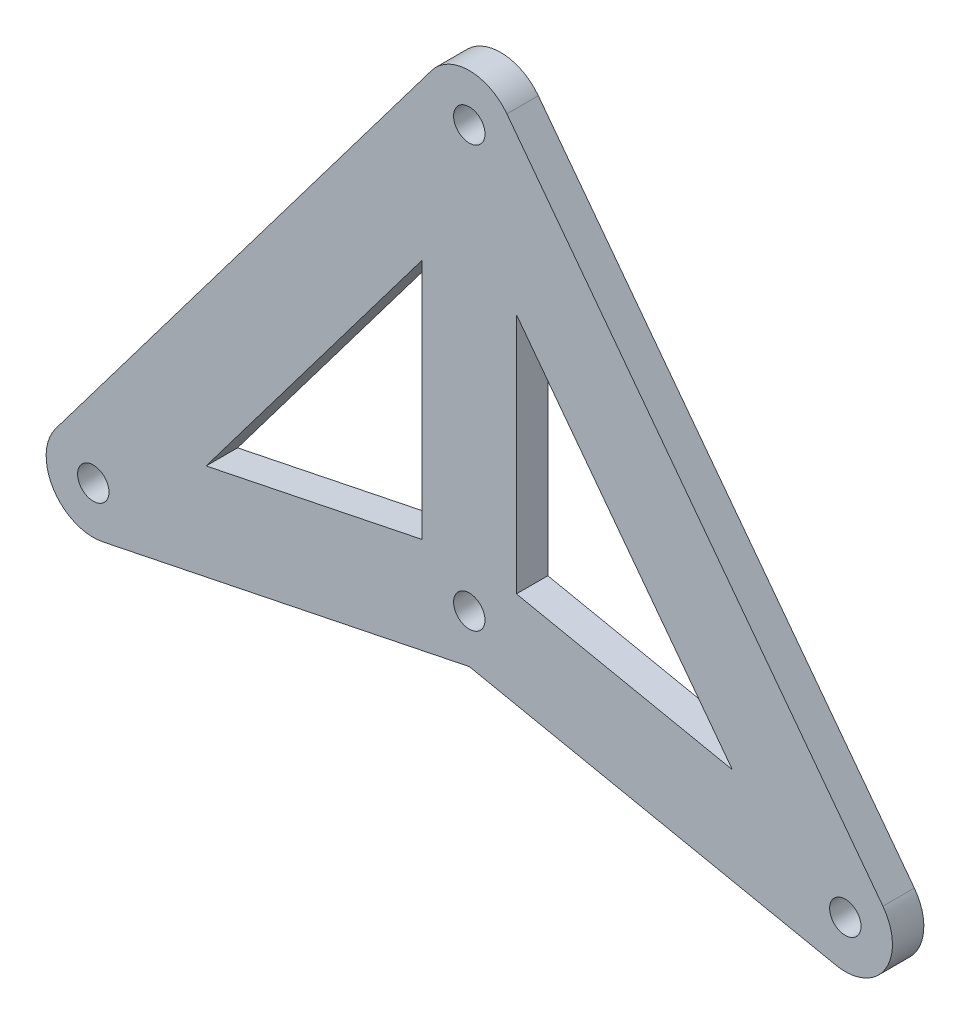
ISO-10303-21;
HEADER;
FILE_DESCRIPTION(('STEP AP214'),'2;1');
FILE_NAME('part.step','',(''),(''),'','','');
FILE_SCHEMA(('AUTOMOTIVE_DESIGN { 1 0 10303 214 1 1 1 1 }'));
ENDSEC;
DATA;
#1=APPLICATION_CONTEXT('core data for automotive mechanical design processes');
#2=APPLICATION_PROTOCOL_DEFINITION('international standard','automotive_design',2000,#1);
#3=PRODUCT_CONTEXT('',#1,'mechanical');
#4=PRODUCT('Part','Part','',(#3));
#5=PRODUCT_RELATED_PRODUCT_CATEGORY('part','',(#4));
#6=PRODUCT_DEFINITION_FORMATION('','',#4);
#7=PRODUCT_DEFINITION_CONTEXT('part definition',#1,'design');
#8=PRODUCT_DEFINITION('design','',#6,#7);
#9=PRODUCT_DEFINITION_SHAPE('','',#8);
#10=(LENGTH_UNIT() NAMED_UNIT(*) SI_UNIT(.MILLI.,.METRE.));
#11=(NAMED_UNIT(*) PLANE_ANGLE_UNIT() SI_UNIT($,.RADIAN.));
#12=(NAMED_UNIT(*) SI_UNIT($,.STERADIAN.) SOLID_ANGLE_UNIT());
#13=UNCERTAINTY_MEASURE_WITH_UNIT(LENGTH_MEASURE(1.E-05),#10,'distance_accuracy_value','');
#14=(GEOMETRIC_REPRESENTATION_CONTEXT(3) GLOBAL_UNCERTAINTY_ASSIGNED_CONTEXT((#13)) GLOBAL_UNIT_ASSIGNED_CONTEXT((#10,
#11,#12)) REPRESENTATION_CONTEXT('',''));
#15=CARTESIAN_POINT('',(0.,0.,0.));
#16=DIRECTION('',(0.,0.,1.));
#17=DIRECTION('',(1.,0.,0.));
#18=AXIS2_PLACEMENT_3D('',#15,#16,#17);
#19=CARTESIAN_POINT('',(-38.,-7.80000000000001,-7.9375));
#20=DIRECTION('',(0.,0.,1.));
#21=DIRECTION('',(1.,0.,0.));
#22=AXIS2_PLACEMENT_3D('',#19,#20,#21);
#23=CYLINDRICAL_SURFACE('',#22,4.76250000000006);
#24=CARTESIAN_POINT('',(-38.,-7.80000000000001,-4.7625));
#25=DIRECTION('',(0.,0.,1.));
#26=DIRECTION('',(1.,0.,0.));
#27=AXIS2_PLACEMENT_3D('',#24,#25,#26);
#28=CIRCLE('',#27,4.76250000000006);
#29=CARTESIAN_POINT('',(-41.8012388247172,-4.93085558964637,-4.7625));
#30=VERTEX_POINT('',#29);
#31=CARTESIAN_POINT('',(-37.0423993591095,-12.4652338915178,-4.7625));
#32=VERTEX_POINT('',#31);
#33=EDGE_CURVE('E181',#30,#32,#28,.T.);
#34=ORIENTED_EDGE('',*,*,#33,.F.);
#35=DIRECTION('',(0.,0.,1.));
#36=VECTOR('',#35,1.);
#37=CARTESIAN_POINT('',(-41.8012388247172,-4.93085558964637,-7.9375));
#38=LINE('',#37,#36);
#39=CARTESIAN_POINT('',(-41.8012388247172,-4.93085558964637,-7.9375));
#40=VERTEX_POINT('',#39);
#41=EDGE_CURVE('E11',#40,#30,#38,.T.);
#42=ORIENTED_EDGE('',*,*,#41,.F.);
#43=CARTESIAN_POINT('',(-38.,-7.80000000000001,-7.9375));
#44=DIRECTION('',(0.,0.,1.));
#45=DIRECTION('',(1.,0.,0.));
#46=AXIS2_PLACEMENT_3D('',#43,#44,#45);
#47=CIRCLE('',#46,4.76250000000006);
#48=CARTESIAN_POINT('',(-37.0423993591095,-12.4652338915178,-7.9375));
#49=VERTEX_POINT('',#48);
#50=EDGE_CURVE('E186',#40,#49,#47,.T.);
#51=ORIENTED_EDGE('',*,*,#50,.T.);
#52=DIRECTION('',(0.,0.,1.));
#53=VECTOR('',#52,1.);
#54=CARTESIAN_POINT('',(-37.0423993591095,-12.4652338915178,-7.9375));
#55=LINE('',#54,#53);
#56=EDGE_CURVE('E38',#49,#32,#55,.T.);
#57=ORIENTED_EDGE('',*,*,#56,.T.);
#58=EDGE_LOOP('',(#34,#42,#51,#57));
#59=FACE_BOUND('',#58,.T.);
#60=ADVANCED_FACE('F35',(#59),#23,.T.);
#61=CARTESIAN_POINT('',(-3.80123882471719,45.4141444103536,-7.9375));
#62=DIRECTION('',(-0.798160383142703,0.602445020546683,0.));
#63=DIRECTION('',(-0.602445020546683,-0.798160383142703,0.));
#64=AXIS2_PLACEMENT_3D('',#61,#62,#63);
#65=PLANE('',#64);
#66=DIRECTION('',(-0.602445020546683,-0.798160383142703,0.));
#67=VECTOR('',#66,1.);
#68=CARTESIAN_POINT('',(-3.80123882471719,45.4141444103536,-4.7625));
#69=LINE('',#68,#67);
#70=CARTESIAN_POINT('',(-3.80123882471719,45.4141444103536,-4.7625));
#71=VERTEX_POINT('',#70);
#72=EDGE_CURVE('E190',#71,#30,#69,.T.);
#73=ORIENTED_EDGE('',*,*,#72,.F.);
#74=DIRECTION('',(0.,0.,1.));
#75=VECTOR('',#74,1.);
#76=CARTESIAN_POINT('',(-3.80123882471719,45.4141444103536,-7.9375));
#77=LINE('',#76,#75);
#78=CARTESIAN_POINT('',(-3.80123882471719,45.4141444103536,-7.9375));
#79=VERTEX_POINT('',#78);
#80=EDGE_CURVE('E43',#79,#71,#77,.T.);
#81=ORIENTED_EDGE('',*,*,#80,.F.);
#82=DIRECTION('',(-0.602445020546683,-0.798160383142703,0.));
#83=VECTOR('',#82,1.);
#84=CARTESIAN_POINT('',(-3.80123882471719,45.4141444103536,-7.9375));
#85=LINE('',#84,#83);
#86=EDGE_CURVE('E205',#79,#40,#85,.T.);
#87=ORIENTED_EDGE('',*,*,#86,.T.);
#88=ORIENTED_EDGE('',*,*,#41,.T.);
#89=EDGE_LOOP('',(#73,#81,#87,#88));
#90=FACE_BOUND('',#89,.T.);
#91=ADVANCED_FACE('F247',(#90),#65,.T.);
#92=CARTESIAN_POINT('',(0.,42.545,-7.9375));
#93=DIRECTION('',(0.,0.,1.));
#94=DIRECTION('',(1.,0.,0.));
#95=AXIS2_PLACEMENT_3D('',#92,#93,#94);
#96=CYLINDRICAL_SURFACE('',#95,4.76250000000008);
#97=CARTESIAN_POINT('',(0.,42.545,-4.7625));
#98=DIRECTION('',(0.,0.,1.));
#99=DIRECTION('',(1.,0.,0.));
#100=AXIS2_PLACEMENT_3D('',#97,#98,#99);
#101=CIRCLE('',#100,4.76250000000008);
#102=CARTESIAN_POINT('',(3.80123882471719,45.4141444103536,-4.7625));
#103=VERTEX_POINT('',#102);
#104=EDGE_CURVE('E222',#103,#71,#101,.T.);
#105=ORIENTED_EDGE('',*,*,#104,.F.);
#106=DIRECTION('',(0.,0.,1.));
#107=VECTOR('',#106,1.);
#108=CARTESIAN_POINT('',(3.80123882471719,45.4141444103536,-7.9375));
#109=LINE('',#108,#107);
#110=CARTESIAN_POINT('',(3.80123882471719,45.4141444103536,-7.9375));
#111=VERTEX_POINT('',#110);
#112=EDGE_CURVE('E228',#111,#103,#109,.T.);
#113=ORIENTED_EDGE('',*,*,#112,.F.);
#114=CARTESIAN_POINT('',(0.,42.545,-7.9375));
#115=DIRECTION('',(0.,0.,1.));
#116=DIRECTION('',(1.,0.,0.));
#117=AXIS2_PLACEMENT_3D('',#114,#115,#116);
#118=CIRCLE('',#117,4.76250000000008);
#119=EDGE_CURVE('E202',#111,#79,#118,.T.);
#120=ORIENTED_EDGE('',*,*,#119,.T.);
#121=ORIENTED_EDGE('',*,*,#80,.T.);
#122=EDGE_LOOP('',(#105,#113,#120,#121));
#123=FACE_BOUND('',#122,.T.);
#124=ADVANCED_FACE('F263',(#123),#96,.T.);
#125=CARTESIAN_POINT('',(41.8012388247172,-4.93085558964637,-7.9375));
#126=DIRECTION('',(0.798160383142703,0.602445020546683,0.));
#127=DIRECTION('',(-0.602445020546683,0.798160383142703,0.));
#128=AXIS2_PLACEMENT_3D('',#125,#126,#127);
#129=PLANE('',#128);
#130=DIRECTION('',(-0.602445020546683,0.798160383142703,0.));
#131=VECTOR('',#130,1.);
#132=CARTESIAN_POINT('',(41.8012388247172,-4.93085558964637,-4.7625));
#133=LINE('',#132,#131);
#134=CARTESIAN_POINT('',(41.8012388247172,-4.93085558964636,-4.7625));
#135=VERTEX_POINT('',#134);
#136=EDGE_CURVE('E219',#135,#103,#133,.T.);
#137=ORIENTED_EDGE('',*,*,#136,.F.);
#138=DIRECTION('',(0.,0.,1.));
#139=VECTOR('',#138,1.);
#140=CARTESIAN_POINT('',(41.8012388247172,-4.93085558964636,-7.9375));
#141=LINE('',#140,#139);
#142=CARTESIAN_POINT('',(41.8012388247172,-4.93085558964636,-7.9375));
#143=VERTEX_POINT('',#142);
#144=EDGE_CURVE('E230',#143,#135,#141,.T.);
#145=ORIENTED_EDGE('',*,*,#144,.F.);
#146=DIRECTION('',(-0.602445020546683,0.798160383142703,0.));
#147=VECTOR('',#146,1.);
#148=CARTESIAN_POINT('',(41.8012388247172,-4.93085558964637,-7.9375));
#149=LINE('',#148,#147);
#150=EDGE_CURVE('E199',#143,#111,#149,.T.);
#151=ORIENTED_EDGE('',*,*,#150,.T.);
#152=ORIENTED_EDGE('',*,*,#112,.T.);
#153=EDGE_LOOP('',(#137,#145,#151,#152));
#154=FACE_BOUND('',#153,.T.);
#155=ADVANCED_FACE('F261',(#154),#129,.T.);
#156=CARTESIAN_POINT('',(38.,-7.80000000000001,-7.9375));
#157=DIRECTION('',(0.,0.,1.));
#158=DIRECTION('',(1.,0.,0.));
#159=AXIS2_PLACEMENT_3D('',#156,#157,#158);
#160=CYLINDRICAL_SURFACE('',#159,4.76250000000011);
#161=CARTESIAN_POINT('',(38.,-7.80000000000001,-4.7625));
#162=DIRECTION('',(0.,0.,1.));
#163=DIRECTION('',(1.,0.,0.));
#164=AXIS2_PLACEMENT_3D('',#161,#162,#163);
#165=CIRCLE('',#164,4.76250000000011);
#166=CARTESIAN_POINT('',(37.0423993591095,-12.4652338915179,-4.7625));
#167=VERTEX_POINT('',#166);
#168=EDGE_CURVE('E216',#167,#135,#165,.T.);
#169=ORIENTED_EDGE('',*,*,#168,.F.);
#170=DIRECTION('',(0.,0.,1.));
#171=VECTOR('',#170,1.);
#172=CARTESIAN_POINT('',(37.0423993591095,-12.4652338915179,-7.9375));
#173=LINE('',#172,#171);
#174=CARTESIAN_POINT('',(37.0423993591095,-12.4652338915179,-7.9375));
#175=VERTEX_POINT('',#174);
#176=EDGE_CURVE('E232',#175,#167,#173,.T.);
#177=ORIENTED_EDGE('',*,*,#176,.F.);
#178=CARTESIAN_POINT('',(38.,-7.80000000000001,-7.9375));
#179=DIRECTION('',(0.,0.,1.));
#180=DIRECTION('',(1.,0.,0.));
#181=AXIS2_PLACEMENT_3D('',#178,#179,#180);
#182=CIRCLE('',#181,4.76250000000011);
#183=EDGE_CURVE('E196',#175,#143,#182,.T.);
#184=ORIENTED_EDGE('',*,*,#183,.T.);
#185=ORIENTED_EDGE('',*,*,#144,.T.);
#186=EDGE_LOOP('',(#169,#177,#184,#185));
#187=FACE_BOUND('',#186,.T.);
#188=ADVANCED_FACE('F259',(#187),#160,.T.);
#189=CARTESIAN_POINT('',(0.,-4.86179402306899,-7.9375));
#190=DIRECTION('',(-0.201071000711917,-0.979576670134966,0.));
#191=DIRECTION('',(0.979576670134966,-0.201071000711917,0.));
#192=AXIS2_PLACEMENT_3D('',#189,#190,#191);
#193=PLANE('',#192);
#194=DIRECTION('',(0.979576670134966,-0.201071000711917,0.));
#195=VECTOR('',#194,1.);
#196=CARTESIAN_POINT('',(0.,-4.86179402306899,-4.7625));
#197=LINE('',#196,#195);
#198=CARTESIAN_POINT('',(0.,-4.86179402306899,-4.7625));
#199=VERTEX_POINT('',#198);
#200=EDGE_CURVE('E213',#199,#167,#197,.T.);
#201=ORIENTED_EDGE('',*,*,#200,.F.);
#202=DIRECTION('',(0.,0.,1.));
#203=VECTOR('',#202,1.);
#204=CARTESIAN_POINT('',(0.,-4.86179402306899,-7.9375));
#205=LINE('',#204,#203);
#206=CARTESIAN_POINT('',(0.,-4.86179402306899,-7.9375));
#207=VERTEX_POINT('',#206);
#208=EDGE_CURVE('E233',#207,#199,#205,.T.);
#209=ORIENTED_EDGE('',*,*,#208,.F.);
#210=DIRECTION('',(0.979576670134966,-0.201071000711917,0.));
#211=VECTOR('',#210,1.);
#212=CARTESIAN_POINT('',(0.,-4.86179402306899,-7.9375));
#213=LINE('',#212,#211);
#214=EDGE_CURVE('E193',#207,#175,#213,.T.);
#215=ORIENTED_EDGE('',*,*,#214,.T.);
#216=ORIENTED_EDGE('',*,*,#176,.T.);
#217=EDGE_LOOP('',(#201,#209,#215,#216));
#218=FACE_BOUND('',#217,.T.);
#219=ADVANCED_FACE('F255',(#218),#193,.T.);
#220=CARTESIAN_POINT('',(-37.0423993591095,-12.4652338915178,-7.9375));
#221=DIRECTION('',(0.201071000711914,-0.979576670134967,0.));
#222=DIRECTION('',(0.979576670134967,0.201071000711914,0.));
#223=AXIS2_PLACEMENT_3D('',#220,#221,#222);
#224=PLANE('',#223);
#225=DIRECTION('',(0.979576670134967,0.201071000711914,0.));
#226=VECTOR('',#225,1.);
#227=CARTESIAN_POINT('',(-37.0423993591095,-12.4652338915178,-4.7625));
#228=LINE('',#227,#226);
#229=EDGE_CURVE('E210',#32,#199,#228,.T.);
#230=ORIENTED_EDGE('',*,*,#229,.F.);
#231=ORIENTED_EDGE('',*,*,#56,.F.);
#232=DIRECTION('',(0.979576670134967,0.201071000711914,0.));
#233=VECTOR('',#232,1.);
#234=CARTESIAN_POINT('',(-37.0423993591095,-12.4652338915178,-7.9375));
#235=LINE('',#234,#233);
#236=EDGE_CURVE('E189',#49,#207,#235,.T.);
#237=ORIENTED_EDGE('',*,*,#236,.T.);
#238=ORIENTED_EDGE('',*,*,#208,.T.);
#239=EDGE_LOOP('',(#230,#231,#237,#238));
#240=FACE_BOUND('',#239,.T.);
#241=ADVANCED_FACE('F241',(#240),#224,.T.);
#242=CARTESIAN_POINT('',(-38.,-7.80000000000001,-7.9375));
#243=DIRECTION('',(0.,0.,1.));
#244=DIRECTION('',(1.,0.,0.));
#245=AXIS2_PLACEMENT_3D('',#242,#243,#244);
#246=PLANE('',#245);
#247=CARTESIAN_POINT('',(0.,42.545,-7.9375));
#248=DIRECTION('',(0.,0.,1.));
#249=DIRECTION('',(1.,0.,0.));
#250=AXIS2_PLACEMENT_3D('',#247,#248,#249);
#251=CIRCLE('',#250,1.5875);
#252=CARTESIAN_POINT('',(1.5875,42.545,-7.9375));
#253=VERTEX_POINT('',#252);
#254=EDGE_CURVE('E432',#253,#253,#251,.T.);
#255=ORIENTED_EDGE('',*,*,#254,.T.);
#256=EDGE_LOOP('',(#255));
#257=FACE_BOUND('',#256,.T.);
#258=CARTESIAN_POINT('',(-38.,-7.80000000000001,-7.9375));
#259=DIRECTION('',(0.,0.,1.));
#260=DIRECTION('',(1.,0.,0.));
#261=AXIS2_PLACEMENT_3D('',#258,#259,#260);
#262=CIRCLE('',#261,1.5875);
#263=CARTESIAN_POINT('',(-36.4125,-7.80000000000001,-7.9375));
#264=VERTEX_POINT('',#263);
#265=EDGE_CURVE('E440',#264,#264,#262,.T.);
#266=ORIENTED_EDGE('',*,*,#265,.T.);
#267=EDGE_LOOP('',(#266));
#268=FACE_BOUND('',#267,.T.);
#269=CARTESIAN_POINT('',(0.,0.,-7.9375));
#270=DIRECTION('',(0.,0.,1.));
#271=DIRECTION('',(1.,0.,0.));
#272=AXIS2_PLACEMENT_3D('',#269,#270,#271);
#273=CIRCLE('',#272,1.5875);
#274=CARTESIAN_POINT('',(1.5875,0.,-7.9375));
#275=VERTEX_POINT('',#274);
#276=EDGE_CURVE('E446',#275,#275,#273,.T.);
#277=ORIENTED_EDGE('',*,*,#276,.T.);
#278=EDGE_LOOP('',(#277));
#279=FACE_BOUND('',#278,.T.);
#280=CARTESIAN_POINT('',(38.,-7.80000000000001,-7.9375));
#281=DIRECTION('',(0.,0.,1.));
#282=DIRECTION('',(1.,0.,0.));
#283=AXIS2_PLACEMENT_3D('',#280,#281,#282);
#284=CIRCLE('',#283,1.5875);
#285=CARTESIAN_POINT('',(39.5875,-7.80000000000001,-7.9375));
#286=VERTEX_POINT('',#285);
#287=EDGE_CURVE('E156',#286,#286,#284,.T.);
#288=ORIENTED_EDGE('',*,*,#287,.T.);
#289=EDGE_LOOP('',(#288));
#290=FACE_BOUND('',#289,.T.);
#291=DIRECTION('',(-0.602445020546683,-0.798160383142703,0.));
#292=VECTOR('',#291,1.);
#293=CARTESIAN_POINT('',(-4.7625,28.3300284546362,-7.9375));
#294=LINE('',#293,#292);
#295=CARTESIAN_POINT('',(-4.7625,28.3300284546362,-7.9375));
#296=VERTEX_POINT('',#295);
#297=CARTESIAN_POINT('',(-26.5968027006594,-0.597549689171587,-7.9375));
#298=VERTEX_POINT('',#297);
#299=EDGE_CURVE('E51',#296,#298,#294,.T.);
#300=ORIENTED_EDGE('',*,*,#299,.T.);
#301=DIRECTION('',(0.979576670134967,0.201071000711913,0.));
#302=VECTOR('',#301,1.);
#303=CARTESIAN_POINT('',(-26.5968027006594,-0.597549689171587,-7.9375));
#304=LINE('',#303,#302);
#305=CARTESIAN_POINT('',(-4.7625,3.88422823359531,-7.9375));
#306=VERTEX_POINT('',#305);
#307=EDGE_CURVE('E132',#298,#306,#304,.T.);
#308=ORIENTED_EDGE('',*,*,#307,.T.);
#309=DIRECTION('',(0.,1.,0.));
#310=VECTOR('',#309,1.);
#311=CARTESIAN_POINT('',(-4.7625,3.88422823359531,-7.9375));
#312=LINE('',#311,#310);
#313=EDGE_CURVE('E139',#306,#296,#312,.T.);
#314=ORIENTED_EDGE('',*,*,#313,.T.);
#315=EDGE_LOOP('',(#300,#308,#314));
#316=FACE_BOUND('',#315,.T.);
#317=DIRECTION('',(0.,-1.,0.));
#318=VECTOR('',#317,1.);
#319=CARTESIAN_POINT('',(4.7625,3.88422823359531,-7.9375));
#320=LINE('',#319,#318);
#321=CARTESIAN_POINT('',(4.76249999999998,28.3300284546362,-7.9375));
#322=VERTEX_POINT('',#321);
#323=CARTESIAN_POINT('',(4.7625,3.88422823359531,-7.9375));
#324=VERTEX_POINT('',#323);
#325=EDGE_CURVE('E169',#322,#324,#320,.T.);
#326=ORIENTED_EDGE('',*,*,#325,.T.);
#327=DIRECTION('',(0.979576670134967,-0.201071000711913,0.));
#328=VECTOR('',#327,1.);
#329=CARTESIAN_POINT('',(4.7625,3.88422823359531,-7.9375));
#330=LINE('',#329,#328);
#331=CARTESIAN_POINT('',(26.5968027006594,-0.597549689171587,-7.9375));
#332=VERTEX_POINT('',#331);
#333=EDGE_CURVE('E162',#324,#332,#330,.T.);
#334=ORIENTED_EDGE('',*,*,#333,.T.);
#335=DIRECTION('',(-0.602445020546683,0.798160383142703,0.));
#336=VECTOR('',#335,1.);
#337=CARTESIAN_POINT('',(26.5968027006594,-0.597549689171587,-7.9375));
#338=LINE('',#337,#336);
#339=EDGE_CURVE('E165',#332,#322,#338,.T.);
#340=ORIENTED_EDGE('',*,*,#339,.T.);
#341=EDGE_LOOP('',(#326,#334,#340));
#342=FACE_BOUND('',#341,.T.);
#343=ORIENTED_EDGE('',*,*,#50,.F.);
#344=ORIENTED_EDGE('',*,*,#86,.F.);
#345=ORIENTED_EDGE('',*,*,#119,.F.);
#346=ORIENTED_EDGE('',*,*,#150,.F.);
#347=ORIENTED_EDGE('',*,*,#183,.F.);
#348=ORIENTED_EDGE('',*,*,#214,.F.);
#349=ORIENTED_EDGE('',*,*,#236,.F.);
#350=EDGE_LOOP('',(#343,#344,#345,#346,#347,#348,#349));
#351=FACE_BOUND('',#350,.T.);
#352=ADVANCED_FACE('F143',(#257,#268,#279,#290,#316,#342,#351),#246,.F.);
#353=CARTESIAN_POINT('',(-38.,-7.80000000000001,-4.7625));
#354=DIRECTION('',(0.,0.,1.));
#355=DIRECTION('',(1.,0.,0.));
#356=AXIS2_PLACEMENT_3D('',#353,#354,#355);
#357=PLANE('',#356);
#358=CARTESIAN_POINT('',(0.,42.545,-4.7625));
#359=DIRECTION('',(0.,0.,1.));
#360=DIRECTION('',(1.,0.,0.));
#361=AXIS2_PLACEMENT_3D('',#358,#359,#360);
#362=CIRCLE('',#361,1.5875);
#363=CARTESIAN_POINT('',(1.5875,42.545,-4.7625));
#364=VERTEX_POINT('',#363);
#365=EDGE_CURVE('E435',#364,#364,#362,.T.);
#366=ORIENTED_EDGE('',*,*,#365,.F.);
#367=EDGE_LOOP('',(#366));
#368=FACE_BOUND('',#367,.T.);
#369=CARTESIAN_POINT('',(-38.,-7.80000000000001,-4.7625));
#370=DIRECTION('',(0.,0.,1.));
#371=DIRECTION('',(1.,0.,0.));
#372=AXIS2_PLACEMENT_3D('',#369,#370,#371);
#373=CIRCLE('',#372,1.5875);
#374=CARTESIAN_POINT('',(-36.4125,-7.80000000000001,-4.7625));
#375=VERTEX_POINT('',#374);
#376=EDGE_CURVE('E437',#375,#375,#373,.T.);
#377=ORIENTED_EDGE('',*,*,#376,.F.);
#378=EDGE_LOOP('',(#377));
#379=FACE_BOUND('',#378,.T.);
#380=CARTESIAN_POINT('',(0.,0.,-4.7625));
#381=DIRECTION('',(0.,0.,1.));
#382=DIRECTION('',(1.,0.,0.));
#383=AXIS2_PLACEMENT_3D('',#380,#381,#382);
#384=CIRCLE('',#383,1.5875);
#385=CARTESIAN_POINT('',(1.5875,0.,-4.7625));
#386=VERTEX_POINT('',#385);
#387=EDGE_CURVE('E443',#386,#386,#384,.T.);
#388=ORIENTED_EDGE('',*,*,#387,.F.);
#389=EDGE_LOOP('',(#388));
#390=FACE_BOUND('',#389,.T.);
#391=CARTESIAN_POINT('',(38.,-7.80000000000001,-4.7625));
#392=DIRECTION('',(0.,0.,1.));
#393=DIRECTION('',(1.,0.,0.));
#394=AXIS2_PLACEMENT_3D('',#391,#392,#393);
#395=CIRCLE('',#394,1.5875);
#396=CARTESIAN_POINT('',(39.5875,-7.80000000000001,-4.7625));
#397=VERTEX_POINT('',#396);
#398=EDGE_CURVE('E151',#397,#397,#395,.T.);
#399=ORIENTED_EDGE('',*,*,#398,.F.);
#400=EDGE_LOOP('',(#399));
#401=FACE_BOUND('',#400,.T.);
#402=DIRECTION('',(0.979576670134967,0.201071000711913,0.));
#403=VECTOR('',#402,1.);
#404=CARTESIAN_POINT('',(-26.5968027006594,-0.597549689171587,-4.7625));
#405=LINE('',#404,#403);
#406=CARTESIAN_POINT('',(-26.5968027006594,-0.597549689171587,-4.7625));
#407=VERTEX_POINT('',#406);
#408=CARTESIAN_POINT('',(-4.7625,3.88422823359531,-4.7625));
#409=VERTEX_POINT('',#408);
#410=EDGE_CURVE('E59',#407,#409,#405,.T.);
#411=ORIENTED_EDGE('',*,*,#410,.F.);
#412=DIRECTION('',(-0.602445020546683,-0.798160383142703,0.));
#413=VECTOR('',#412,1.);
#414=CARTESIAN_POINT('',(-4.7625,28.3300284546362,-4.7625));
#415=LINE('',#414,#413);
#416=CARTESIAN_POINT('',(-4.7625,28.3300284546362,-4.7625));
#417=VERTEX_POINT('',#416);
#418=EDGE_CURVE('E145',#417,#407,#415,.T.);
#419=ORIENTED_EDGE('',*,*,#418,.F.);
#420=DIRECTION('',(0.,1.,0.));
#421=VECTOR('',#420,1.);
#422=CARTESIAN_POINT('',(-4.7625,3.88422823359531,-4.7625));
#423=LINE('',#422,#421);
#424=EDGE_CURVE('E148',#409,#417,#423,.T.);
#425=ORIENTED_EDGE('',*,*,#424,.F.);
#426=EDGE_LOOP('',(#411,#419,#425));
#427=FACE_BOUND('',#426,.T.);
#428=DIRECTION('',(0.979576670134967,-0.201071000711913,0.));
#429=VECTOR('',#428,1.);
#430=CARTESIAN_POINT('',(4.7625,3.88422823359531,-4.7625));
#431=LINE('',#430,#429);
#432=CARTESIAN_POINT('',(4.7625,3.88422823359531,-4.7625));
#433=VERTEX_POINT('',#432);
#434=CARTESIAN_POINT('',(26.5968027006594,-0.597549689171587,-4.7625));
#435=VERTEX_POINT('',#434);
#436=EDGE_CURVE('E160',#433,#435,#431,.T.);
#437=ORIENTED_EDGE('',*,*,#436,.F.);
#438=DIRECTION('',(0.,-1.,0.));
#439=VECTOR('',#438,1.);
#440=CARTESIAN_POINT('',(4.7625,3.88422823359531,-4.7625));
#441=LINE('',#440,#439);
#442=CARTESIAN_POINT('',(4.7625,28.3300284546362,-4.7625));
#443=VERTEX_POINT('',#442);
#444=EDGE_CURVE('E166',#443,#433,#441,.T.);
#445=ORIENTED_EDGE('',*,*,#444,.F.);
#446=DIRECTION('',(-0.602445020546683,0.798160383142703,0.));
#447=VECTOR('',#446,1.);
#448=CARTESIAN_POINT('',(26.5968027006594,-0.597549689171587,-4.7625));
#449=LINE('',#448,#447);
#450=EDGE_CURVE('E174',#435,#443,#449,.T.);
#451=ORIENTED_EDGE('',*,*,#450,.F.);
#452=EDGE_LOOP('',(#437,#445,#451));
#453=FACE_BOUND('',#452,.T.);
#454=ORIENTED_EDGE('',*,*,#33,.T.);
#455=ORIENTED_EDGE('',*,*,#229,.T.);
#456=ORIENTED_EDGE('',*,*,#200,.T.);
#457=ORIENTED_EDGE('',*,*,#168,.T.);
#458=ORIENTED_EDGE('',*,*,#136,.T.);
#459=ORIENTED_EDGE('',*,*,#104,.T.);
#460=ORIENTED_EDGE('',*,*,#72,.T.);
#461=EDGE_LOOP('',(#454,#455,#456,#457,#458,#459,#460));
#462=FACE_BOUND('',#461,.T.);
#463=ADVANCED_FACE('F243',(#368,#379,#390,#401,#427,#453,#462),#357,.T.);
#464=CARTESIAN_POINT('',(4.7625,3.88422823359531,-7.9375));
#465=DIRECTION('',(-0.201071000711913,-0.979576670134967,0.));
#466=DIRECTION('',(0.979576670134967,-0.201071000711913,0.));
#467=AXIS2_PLACEMENT_3D('',#464,#465,#466);
#468=PLANE('',#467);
#469=ORIENTED_EDGE('',*,*,#436,.T.);
#470=DIRECTION('',(0.,0.,1.));
#471=VECTOR('',#470,1.);
#472=CARTESIAN_POINT('',(26.5968027006594,-0.597549689171587,-7.9375));
#473=LINE('',#472,#471);
#474=EDGE_CURVE('E172',#332,#435,#473,.T.);
#475=ORIENTED_EDGE('',*,*,#474,.F.);
#476=ORIENTED_EDGE('',*,*,#333,.F.);
#477=DIRECTION('',(0.,0.,1.));
#478=VECTOR('',#477,1.);
#479=CARTESIAN_POINT('',(4.7625,3.88422823359531,-7.9375));
#480=LINE('',#479,#478);
#481=EDGE_CURVE('E179',#324,#433,#480,.T.);
#482=ORIENTED_EDGE('',*,*,#481,.T.);
#483=EDGE_LOOP('',(#469,#475,#476,#482));
#484=FACE_BOUND('',#483,.T.);
#485=ADVANCED_FACE('F330',(#484),#468,.F.);
#486=CARTESIAN_POINT('',(4.7625,3.88422823359531,-7.9375));
#487=DIRECTION('',(-1.,0.,0.));
#488=DIRECTION('',(0.,0.,1.));
#489=AXIS2_PLACEMENT_3D('',#486,#487,#488);
#490=PLANE('',#489);
#491=ORIENTED_EDGE('',*,*,#444,.T.);
#492=ORIENTED_EDGE('',*,*,#481,.F.);
#493=ORIENTED_EDGE('',*,*,#325,.F.);
#494=DIRECTION('',(0.,0.,1.));
#495=VECTOR('',#494,1.);
#496=CARTESIAN_POINT('',(4.7625,28.3300284546362,-7.9375));
#497=LINE('',#496,#495);
#498=EDGE_CURVE('E182',#322,#443,#497,.T.);
#499=ORIENTED_EDGE('',*,*,#498,.T.);
#500=EDGE_LOOP('',(#491,#492,#493,#499));
#501=FACE_BOUND('',#500,.T.);
#502=ADVANCED_FACE('F340',(#501),#490,.F.);
#503=CARTESIAN_POINT('',(26.5968027006594,-0.597549689171587,-7.9375));
#504=DIRECTION('',(0.798160383142703,0.602445020546683,0.));
#505=DIRECTION('',(-0.602445020546683,0.798160383142704,0.));
#506=AXIS2_PLACEMENT_3D('',#503,#504,#505);
#507=PLANE('',#506);
#508=ORIENTED_EDGE('',*,*,#450,.T.);
#509=ORIENTED_EDGE('',*,*,#498,.F.);
#510=ORIENTED_EDGE('',*,*,#339,.F.);
#511=ORIENTED_EDGE('',*,*,#474,.T.);
#512=EDGE_LOOP('',(#508,#509,#510,#511));
#513=FACE_BOUND('',#512,.T.);
#514=ADVANCED_FACE('F350',(#513),#507,.F.);
#515=CARTESIAN_POINT('',(-26.5968027006594,-0.597549689171587,-7.9375));
#516=DIRECTION('',(0.201071000711913,-0.979576670134967,0.));
#517=DIRECTION('',(0.979576670134967,0.201071000711913,0.));
#518=AXIS2_PLACEMENT_3D('',#515,#516,#517);
#519=PLANE('',#518);
#520=ORIENTED_EDGE('',*,*,#410,.T.);
#521=DIRECTION('',(0.,0.,1.));
#522=VECTOR('',#521,1.);
#523=CARTESIAN_POINT('',(-4.7625,3.88422823359531,-7.9375));
#524=LINE('',#523,#522);
#525=EDGE_CURVE('E128',#306,#409,#524,.T.);
#526=ORIENTED_EDGE('',*,*,#525,.F.);
#527=ORIENTED_EDGE('',*,*,#307,.F.);
#528=DIRECTION('',(0.,0.,1.));
#529=VECTOR('',#528,1.);
#530=CARTESIAN_POINT('',(-26.5968027006594,-0.597549689171587,-7.9375));
#531=LINE('',#530,#529);
#532=EDGE_CURVE('E158',#298,#407,#531,.T.);
#533=ORIENTED_EDGE('',*,*,#532,.T.);
#534=EDGE_LOOP('',(#520,#526,#527,#533));
#535=FACE_BOUND('',#534,.T.);
#536=ADVANCED_FACE('F130',(#535),#519,.F.);
#537=CARTESIAN_POINT('',(-4.7625,28.3300284546362,-7.9375));
#538=DIRECTION('',(-0.798160383142703,0.602445020546683,0.));
#539=DIRECTION('',(-0.602445020546683,-0.798160383142704,0.));
#540=AXIS2_PLACEMENT_3D('',#537,#538,#539);
#541=PLANE('',#540);
#542=ORIENTED_EDGE('',*,*,#418,.T.);
#543=ORIENTED_EDGE('',*,*,#532,.F.);
#544=ORIENTED_EDGE('',*,*,#299,.F.);
#545=DIRECTION('',(0.,0.,1.));
#546=VECTOR('',#545,1.);
#547=CARTESIAN_POINT('',(-4.7625,28.3300284546362,-7.9375));
#548=LINE('',#547,#546);
#549=EDGE_CURVE('E136',#296,#417,#548,.T.);
#550=ORIENTED_EDGE('',*,*,#549,.T.);
#551=EDGE_LOOP('',(#542,#543,#544,#550));
#552=FACE_BOUND('',#551,.T.);
#553=ADVANCED_FACE('F369',(#552),#541,.F.);
#554=CARTESIAN_POINT('',(-4.7625,3.88422823359531,-7.9375));
#555=DIRECTION('',(1.,0.,0.));
#556=DIRECTION('',(0.,1.,0.));
#557=AXIS2_PLACEMENT_3D('',#554,#555,#556);
#558=PLANE('',#557);
#559=ORIENTED_EDGE('',*,*,#424,.T.);
#560=ORIENTED_EDGE('',*,*,#549,.F.);
#561=ORIENTED_EDGE('',*,*,#313,.F.);
#562=ORIENTED_EDGE('',*,*,#525,.T.);
#563=EDGE_LOOP('',(#559,#560,#561,#562));
#564=FACE_BOUND('',#563,.T.);
#565=ADVANCED_FACE('F140',(#564),#558,.F.);
#566=CARTESIAN_POINT('',(38.,-7.80000000000001,-7.9375));
#567=DIRECTION('',(0.,0.,1.));
#568=DIRECTION('',(1.,0.,0.));
#569=AXIS2_PLACEMENT_3D('',#566,#567,#568);
#570=CYLINDRICAL_SURFACE('',#569,1.5875);
#571=ORIENTED_EDGE('',*,*,#287,.F.);
#572=EDGE_LOOP('',(#571));
#573=FACE_BOUND('',#572,.T.);
#574=ORIENTED_EDGE('',*,*,#398,.T.);
#575=EDGE_LOOP('',(#574));
#576=FACE_BOUND('',#575,.T.);
#577=ADVANCED_FACE('F386',(#573,#576),#570,.F.);
#578=CARTESIAN_POINT('',(0.,0.,-7.9375));
#579=DIRECTION('',(0.,0.,1.));
#580=DIRECTION('',(1.,0.,0.));
#581=AXIS2_PLACEMENT_3D('',#578,#579,#580);
#582=CYLINDRICAL_SURFACE('',#581,1.5875);
#583=ORIENTED_EDGE('',*,*,#276,.F.);
#584=EDGE_LOOP('',(#583));
#585=FACE_BOUND('',#584,.T.);
#586=ORIENTED_EDGE('',*,*,#387,.T.);
#587=EDGE_LOOP('',(#586));
#588=FACE_BOUND('',#587,.T.);
#589=ADVANCED_FACE('F395',(#585,#588),#582,.F.);
#590=CARTESIAN_POINT('',(-38.,-7.80000000000001,-7.9375));
#591=DIRECTION('',(0.,0.,1.));
#592=DIRECTION('',(1.,0.,0.));
#593=AXIS2_PLACEMENT_3D('',#590,#591,#592);
#594=CYLINDRICAL_SURFACE('',#593,1.5875);
#595=ORIENTED_EDGE('',*,*,#265,.F.);
#596=EDGE_LOOP('',(#595));
#597=FACE_BOUND('',#596,.T.);
#598=ORIENTED_EDGE('',*,*,#376,.T.);
#599=EDGE_LOOP('',(#598));
#600=FACE_BOUND('',#599,.T.);
#601=ADVANCED_FACE('F405',(#597,#600),#594,.F.);
#602=CARTESIAN_POINT('',(0.,42.545,-7.9375));
#603=DIRECTION('',(0.,0.,1.));
#604=DIRECTION('',(1.,0.,0.));
#605=AXIS2_PLACEMENT_3D('',#602,#603,#604);
#606=CYLINDRICAL_SURFACE('',#605,1.5875);
#607=ORIENTED_EDGE('',*,*,#254,.F.);
#608=EDGE_LOOP('',(#607));
#609=FACE_BOUND('',#608,.T.);
#610=ORIENTED_EDGE('',*,*,#365,.T.);
#611=EDGE_LOOP('',(#610));
#612=FACE_BOUND('',#611,.T.);
#613=ADVANCED_FACE('F415',(#609,#612),#606,.F.);
#614=CLOSED_SHELL('',(#60,#91,#124,#155,#188,#219,#241,#352,#463,#485,#502,#514,#536,#553,#565,
#577,#589,#601,#613));
#615=MANIFOLD_SOLID_BREP('B2',#614);
#616=ADVANCED_BREP_SHAPE_REPRESENTATION('',(#18,#615),#14);
#617=SHAPE_DEFINITION_REPRESENTATION(#9,#616);
ENDSEC;
END-ISO-10303-21;
